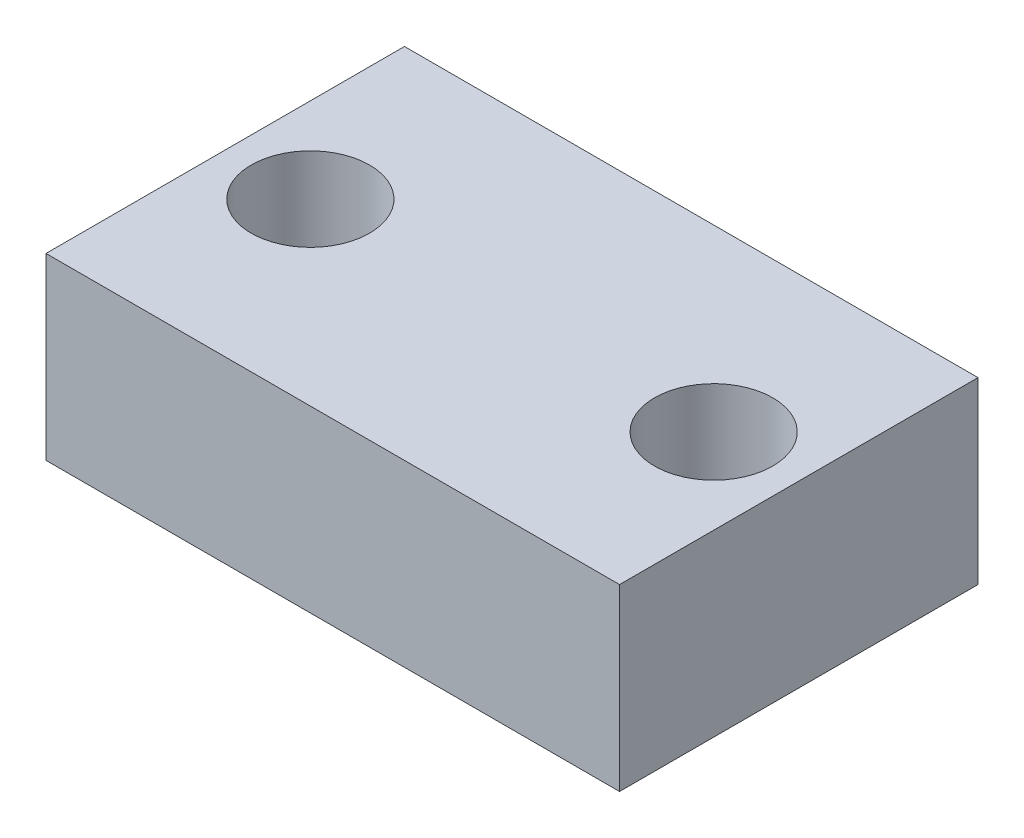
ISO-10303-21;
HEADER;
FILE_DESCRIPTION(('STEP AP214'),'2;1');
FILE_NAME('part.step','',(''),(''),'','','');
FILE_SCHEMA(('AUTOMOTIVE_DESIGN { 1 0 10303 214 1 1 1 1 }'));
ENDSEC;
DATA;
#1=APPLICATION_CONTEXT('core data for automotive mechanical design processes');
#2=APPLICATION_PROTOCOL_DEFINITION('international standard','automotive_design',2000,#1);
#3=PRODUCT_CONTEXT('',#1,'mechanical');
#4=PRODUCT('Part','Part','',(#3));
#5=PRODUCT_RELATED_PRODUCT_CATEGORY('part','',(#4));
#6=PRODUCT_DEFINITION_FORMATION('','',#4);
#7=PRODUCT_DEFINITION_CONTEXT('part definition',#1,'design');
#8=PRODUCT_DEFINITION('design','',#6,#7);
#9=PRODUCT_DEFINITION_SHAPE('','',#8);
#10=(LENGTH_UNIT() NAMED_UNIT(*) SI_UNIT(.MILLI.,.METRE.));
#11=(NAMED_UNIT(*) PLANE_ANGLE_UNIT() SI_UNIT($,.RADIAN.));
#12=(NAMED_UNIT(*) SI_UNIT($,.STERADIAN.) SOLID_ANGLE_UNIT());
#13=UNCERTAINTY_MEASURE_WITH_UNIT(LENGTH_MEASURE(1.E-05),#10,'distance_accuracy_value','');
#14=(GEOMETRIC_REPRESENTATION_CONTEXT(3) GLOBAL_UNCERTAINTY_ASSIGNED_CONTEXT((#13)) GLOBAL_UNIT_ASSIGNED_CONTEXT((#10,
#11,#12)) REPRESENTATION_CONTEXT('',''));
#15=CARTESIAN_POINT('',(0.,0.,0.));
#16=DIRECTION('',(0.,0.,1.));
#17=DIRECTION('',(1.,0.,0.));
#18=AXIS2_PLACEMENT_3D('',#15,#16,#17);
#19=CARTESIAN_POINT('',(-8.,5.,5.));
#20=DIRECTION('',(-1.,0.,0.));
#21=DIRECTION('',(0.,0.,1.));
#22=AXIS2_PLACEMENT_3D('',#19,#20,#21);
#23=PLANE('',#22);
#24=DIRECTION('',(0.,0.,-1.));
#25=VECTOR('',#24,1.);
#26=CARTESIAN_POINT('',(-8.,0.,5.));
#27=LINE('',#26,#25);
#28=CARTESIAN_POINT('',(-8.,0.,5.));
#29=VERTEX_POINT('',#28);
#30=CARTESIAN_POINT('',(-8.,0.,-5.));
#31=VERTEX_POINT('',#30);
#32=EDGE_CURVE('E99',#29,#31,#27,.T.);
#33=ORIENTED_EDGE('',*,*,#32,.F.);
#34=DIRECTION('',(0.,-1.,0.));
#35=VECTOR('',#34,1.);
#36=CARTESIAN_POINT('',(-8.,5.,5.));
#37=LINE('',#36,#35);
#38=CARTESIAN_POINT('',(-8.,5.,5.));
#39=VERTEX_POINT('',#38);
#40=EDGE_CURVE('E11',#39,#29,#37,.T.);
#41=ORIENTED_EDGE('',*,*,#40,.F.);
#42=DIRECTION('',(0.,0.,-1.));
#43=VECTOR('',#42,1.);
#44=CARTESIAN_POINT('',(-8.,5.,5.));
#45=LINE('',#44,#43);
#46=CARTESIAN_POINT('',(-8.,5.,-5.));
#47=VERTEX_POINT('',#46);
#48=EDGE_CURVE('E93',#39,#47,#45,.T.);
#49=ORIENTED_EDGE('',*,*,#48,.T.);
#50=DIRECTION('',(0.,-1.,0.));
#51=VECTOR('',#50,1.);
#52=CARTESIAN_POINT('',(-8.,5.,-5.));
#53=LINE('',#52,#51);
#54=EDGE_CURVE('E36',#47,#31,#53,.T.);
#55=ORIENTED_EDGE('',*,*,#54,.T.);
#56=EDGE_LOOP('',(#33,#41,#49,#55));
#57=FACE_BOUND('',#56,.T.);
#58=ADVANCED_FACE('F33',(#57),#23,.T.);
#59=CARTESIAN_POINT('',(-8.,5.,5.));
#60=DIRECTION('',(0.,0.,-1.));
#61=DIRECTION('',(-1.,0.,0.));
#62=AXIS2_PLACEMENT_3D('',#59,#60,#61);
#63=PLANE('',#62);
#64=DIRECTION('',(1.,0.,0.));
#65=VECTOR('',#64,1.);
#66=CARTESIAN_POINT('',(-8.,0.,5.));
#67=LINE('',#66,#65);
#68=CARTESIAN_POINT('',(8.,0.,5.));
#69=VERTEX_POINT('',#68);
#70=EDGE_CURVE('E66',#29,#69,#67,.T.);
#71=ORIENTED_EDGE('',*,*,#70,.T.);
#72=DIRECTION('',(0.,-1.,0.));
#73=VECTOR('',#72,1.);
#74=CARTESIAN_POINT('',(8.,5.,5.));
#75=LINE('',#74,#73);
#76=CARTESIAN_POINT('',(8.,5.,5.));
#77=VERTEX_POINT('',#76);
#78=EDGE_CURVE('E42',#77,#69,#75,.T.);
#79=ORIENTED_EDGE('',*,*,#78,.F.);
#80=DIRECTION('',(1.,0.,0.));
#81=VECTOR('',#80,1.);
#82=CARTESIAN_POINT('',(-8.,5.,5.));
#83=LINE('',#82,#81);
#84=EDGE_CURVE('E83',#39,#77,#83,.T.);
#85=ORIENTED_EDGE('',*,*,#84,.F.);
#86=ORIENTED_EDGE('',*,*,#40,.T.);
#87=EDGE_LOOP('',(#71,#79,#85,#86));
#88=FACE_BOUND('',#87,.T.);
#89=ADVANCED_FACE('F110',(#88),#63,.F.);
#90=CARTESIAN_POINT('',(8.,5.,5.));
#91=DIRECTION('',(-1.,0.,0.));
#92=DIRECTION('',(0.,0.,1.));
#93=AXIS2_PLACEMENT_3D('',#90,#91,#92);
#94=PLANE('',#93);
#95=DIRECTION('',(0.,0.,-1.));
#96=VECTOR('',#95,1.);
#97=CARTESIAN_POINT('',(8.,0.,5.));
#98=LINE('',#97,#96);
#99=CARTESIAN_POINT('',(8.,0.,-5.));
#100=VERTEX_POINT('',#99);
#101=EDGE_CURVE('E90',#69,#100,#98,.T.);
#102=ORIENTED_EDGE('',*,*,#101,.T.);
#103=DIRECTION('',(0.,-1.,0.));
#104=VECTOR('',#103,1.);
#105=CARTESIAN_POINT('',(8.,5.,-5.));
#106=LINE('',#105,#104);
#107=CARTESIAN_POINT('',(8.,5.,-5.));
#108=VERTEX_POINT('',#107);
#109=EDGE_CURVE('E87',#108,#100,#106,.T.);
#110=ORIENTED_EDGE('',*,*,#109,.F.);
#111=DIRECTION('',(0.,0.,-1.));
#112=VECTOR('',#111,1.);
#113=CARTESIAN_POINT('',(8.,5.,5.));
#114=LINE('',#113,#112);
#115=EDGE_CURVE('E78',#77,#108,#114,.T.);
#116=ORIENTED_EDGE('',*,*,#115,.F.);
#117=ORIENTED_EDGE('',*,*,#78,.T.);
#118=EDGE_LOOP('',(#102,#110,#116,#117));
#119=FACE_BOUND('',#118,.T.);
#120=ADVANCED_FACE('F88',(#119),#94,.F.);
#121=CARTESIAN_POINT('',(-8.,5.,-5.));
#122=DIRECTION('',(0.,0.,-1.));
#123=DIRECTION('',(-1.,0.,0.));
#124=AXIS2_PLACEMENT_3D('',#121,#122,#123);
#125=PLANE('',#124);
#126=DIRECTION('',(1.,0.,0.));
#127=VECTOR('',#126,1.);
#128=CARTESIAN_POINT('',(-8.,0.,-5.));
#129=LINE('',#128,#127);
#130=EDGE_CURVE('E102',#31,#100,#129,.T.);
#131=ORIENTED_EDGE('',*,*,#130,.F.);
#132=ORIENTED_EDGE('',*,*,#54,.F.);
#133=DIRECTION('',(1.,0.,0.));
#134=VECTOR('',#133,1.);
#135=CARTESIAN_POINT('',(-8.,5.,-5.));
#136=LINE('',#135,#134);
#137=EDGE_CURVE('E82',#47,#108,#136,.T.);
#138=ORIENTED_EDGE('',*,*,#137,.T.);
#139=ORIENTED_EDGE('',*,*,#109,.T.);
#140=EDGE_LOOP('',(#131,#132,#138,#139));
#141=FACE_BOUND('',#140,.T.);
#142=ADVANCED_FACE('F92',(#141),#125,.T.);
#143=CARTESIAN_POINT('',(0.,5.,0.));
#144=DIRECTION('',(0.,-1.,0.));
#145=DIRECTION('',(0.,0.,-1.));
#146=AXIS2_PLACEMENT_3D('',#143,#144,#145);
#147=PLANE('',#146);
#148=CARTESIAN_POINT('',(5.625,5.,0.));
#149=DIRECTION('',(0.,-1.,0.));
#150=DIRECTION('',(0.,0.,-1.));
#151=AXIS2_PLACEMENT_3D('',#148,#149,#150);
#152=CIRCLE('',#151,1.65);
#153=CARTESIAN_POINT('',(5.625,5.,-1.65));
#154=VERTEX_POINT('',#153);
#155=EDGE_CURVE('E147',#154,#154,#152,.F.);
#156=ORIENTED_EDGE('',*,*,#155,.F.);
#157=EDGE_LOOP('',(#156));
#158=FACE_BOUND('',#157,.T.);
#159=CARTESIAN_POINT('',(-5.625,5.,0.));
#160=DIRECTION('',(0.,-1.,0.));
#161=DIRECTION('',(0.,0.,-1.));
#162=AXIS2_PLACEMENT_3D('',#159,#160,#161);
#163=CIRCLE('',#162,1.65);
#164=CARTESIAN_POINT('',(-5.625,5.,-1.65));
#165=VERTEX_POINT('',#164);
#166=EDGE_CURVE('E103',#165,#165,#163,.F.);
#167=ORIENTED_EDGE('',*,*,#166,.F.);
#168=EDGE_LOOP('',(#167));
#169=FACE_BOUND('',#168,.T.);
#170=ORIENTED_EDGE('',*,*,#48,.F.);
#171=ORIENTED_EDGE('',*,*,#84,.T.);
#172=ORIENTED_EDGE('',*,*,#115,.T.);
#173=ORIENTED_EDGE('',*,*,#137,.F.);
#174=EDGE_LOOP('',(#170,#171,#172,#173));
#175=FACE_BOUND('',#174,.T.);
#176=ADVANCED_FACE('F81',(#158,#169,#175),#147,.F.);
#177=CARTESIAN_POINT('',(0.,0.,0.));
#178=DIRECTION('',(0.,-1.,0.));
#179=DIRECTION('',(0.,0.,-1.));
#180=AXIS2_PLACEMENT_3D('',#177,#178,#179);
#181=PLANE('',#180);
#182=CARTESIAN_POINT('',(5.625,0.,0.));
#183=DIRECTION('',(0.,-1.,0.));
#184=DIRECTION('',(0.,0.,-1.));
#185=AXIS2_PLACEMENT_3D('',#182,#183,#184);
#186=CIRCLE('',#185,1.65);
#187=CARTESIAN_POINT('',(5.625,0.,-1.65));
#188=VERTEX_POINT('',#187);
#189=EDGE_CURVE('E145',#188,#188,#186,.T.);
#190=ORIENTED_EDGE('',*,*,#189,.F.);
#191=EDGE_LOOP('',(#190));
#192=FACE_BOUND('',#191,.T.);
#193=CARTESIAN_POINT('',(-5.625,0.,0.));
#194=DIRECTION('',(0.,-1.,0.));
#195=DIRECTION('',(0.,0.,-1.));
#196=AXIS2_PLACEMENT_3D('',#193,#194,#195);
#197=CIRCLE('',#196,1.65);
#198=CARTESIAN_POINT('',(-5.625,0.,-1.65));
#199=VERTEX_POINT('',#198);
#200=EDGE_CURVE('E148',#199,#199,#197,.T.);
#201=ORIENTED_EDGE('',*,*,#200,.F.);
#202=EDGE_LOOP('',(#201));
#203=FACE_BOUND('',#202,.T.);
#204=ORIENTED_EDGE('',*,*,#32,.T.);
#205=ORIENTED_EDGE('',*,*,#130,.T.);
#206=ORIENTED_EDGE('',*,*,#101,.F.);
#207=ORIENTED_EDGE('',*,*,#70,.F.);
#208=EDGE_LOOP('',(#204,#205,#206,#207));
#209=FACE_BOUND('',#208,.T.);
#210=ADVANCED_FACE('F108',(#192,#203,#209),#181,.T.);
#211=CARTESIAN_POINT('',(-5.625,5.001,0.));
#212=DIRECTION('',(0.,-1.,0.));
#213=DIRECTION('',(0.,0.,-1.));
#214=AXIS2_PLACEMENT_3D('',#211,#212,#213);
#215=CYLINDRICAL_SURFACE('',#214,1.65);
#216=ORIENTED_EDGE('',*,*,#200,.T.);
#217=EDGE_LOOP('',(#216));
#218=FACE_BOUND('',#217,.T.);
#219=ORIENTED_EDGE('',*,*,#166,.T.);
#220=EDGE_LOOP('',(#219));
#221=FACE_BOUND('',#220,.T.);
#222=ADVANCED_FACE('F129',(#218,#221),#215,.F.);
#223=CARTESIAN_POINT('',(5.625,5.001,0.));
#224=DIRECTION('',(0.,-1.,0.));
#225=DIRECTION('',(0.,0.,-1.));
#226=AXIS2_PLACEMENT_3D('',#223,#224,#225);
#227=CYLINDRICAL_SURFACE('',#226,1.65);
#228=ORIENTED_EDGE('',*,*,#189,.T.);
#229=EDGE_LOOP('',(#228));
#230=FACE_BOUND('',#229,.T.);
#231=ORIENTED_EDGE('',*,*,#155,.T.);
#232=EDGE_LOOP('',(#231));
#233=FACE_BOUND('',#232,.T.);
#234=ADVANCED_FACE('F136',(#230,#233),#227,.F.);
#235=CLOSED_SHELL('',(#58,#89,#120,#142,#176,#210,#222,#234));
#236=MANIFOLD_SOLID_BREP('B2',#235);
#237=ADVANCED_BREP_SHAPE_REPRESENTATION('',(#18,#236),#14);
#238=SHAPE_DEFINITION_REPRESENTATION(#9,#237);
ENDSEC;
END-ISO-10303-21;
